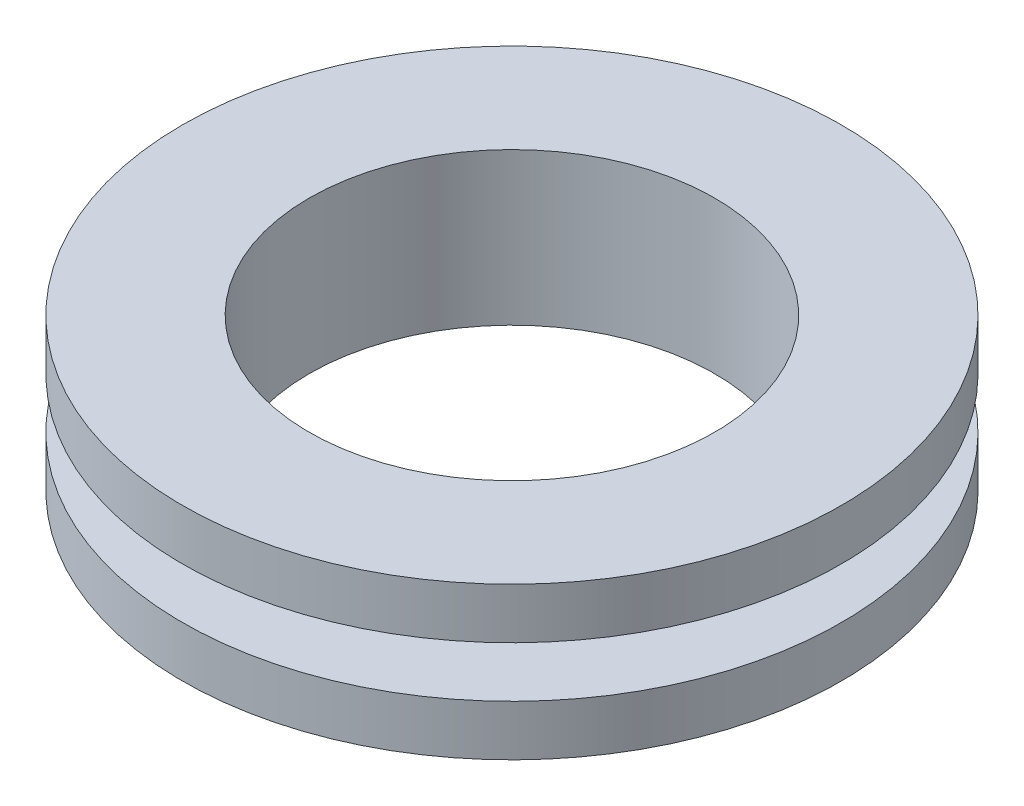
ISO-10303-21;
HEADER;
FILE_DESCRIPTION(('STEP AP214'),'2;1');
FILE_NAME('part.step','',(''),(''),'','','');
FILE_SCHEMA(('AUTOMOTIVE_DESIGN { 1 0 10303 214 1 1 1 1 }'));
ENDSEC;
DATA;
#1=APPLICATION_CONTEXT('core data for automotive mechanical design processes');
#2=APPLICATION_PROTOCOL_DEFINITION('international standard','automotive_design',2000,#1);
#3=PRODUCT_CONTEXT('',#1,'mechanical');
#4=PRODUCT('Part','Part','',(#3));
#5=PRODUCT_RELATED_PRODUCT_CATEGORY('part','',(#4));
#6=PRODUCT_DEFINITION_FORMATION('','',#4);
#7=PRODUCT_DEFINITION_CONTEXT('part definition',#1,'design');
#8=PRODUCT_DEFINITION('design','',#6,#7);
#9=PRODUCT_DEFINITION_SHAPE('','',#8);
#10=(LENGTH_UNIT() NAMED_UNIT(*) SI_UNIT(.MILLI.,.METRE.));
#11=(NAMED_UNIT(*) PLANE_ANGLE_UNIT() SI_UNIT($,.RADIAN.));
#12=(NAMED_UNIT(*) SI_UNIT($,.STERADIAN.) SOLID_ANGLE_UNIT());
#13=UNCERTAINTY_MEASURE_WITH_UNIT(LENGTH_MEASURE(1.E-05),#10,'distance_accuracy_value','');
#14=(GEOMETRIC_REPRESENTATION_CONTEXT(3) GLOBAL_UNCERTAINTY_ASSIGNED_CONTEXT((#13)) GLOBAL_UNIT_ASSIGNED_CONTEXT((#10,
#11,#12)) REPRESENTATION_CONTEXT('',''));
#15=CARTESIAN_POINT('',(0.,0.,0.));
#16=DIRECTION('',(0.,0.,1.));
#17=DIRECTION('',(1.,0.,0.));
#18=AXIS2_PLACEMENT_3D('',#15,#16,#17);
#19=CARTESIAN_POINT('',(5.,0.5,0.));
#20=DIRECTION('',(0.,1.,0.));
#21=DIRECTION('',(-1.,0.,0.));
#22=AXIS2_PLACEMENT_3D('',#19,#20,#21);
#23=PLANE('',#22);
#24=CARTESIAN_POINT('',(0.,0.499999999999999,0.));
#25=DIRECTION('',(0.,1.,0.));
#26=DIRECTION('',(-1.,0.,0.));
#27=AXIS2_PLACEMENT_3D('',#24,#25,#26);
#28=CIRCLE('',#27,6.5);
#29=CARTESIAN_POINT('',(-6.5,0.499999999999998,0.));
#30=VERTEX_POINT('',#29);
#31=EDGE_CURVE('E10',#30,#30,#28,.T.);
#32=ORIENTED_EDGE('',*,*,#31,.F.);
#33=EDGE_LOOP('',(#32));
#34=FACE_BOUND('',#33,.T.);
#35=CARTESIAN_POINT('',(0.,0.5,0.));
#36=DIRECTION('',(0.,1.,0.));
#37=DIRECTION('',(-1.,0.,0.));
#38=AXIS2_PLACEMENT_3D('',#35,#36,#37);
#39=CIRCLE('',#38,5.);
#40=CARTESIAN_POINT('',(-5.,0.499999999999999,0.));
#41=VERTEX_POINT('',#40);
#42=EDGE_CURVE('E78',#41,#41,#39,.T.);
#43=ORIENTED_EDGE('',*,*,#42,.T.);
#44=EDGE_LOOP('',(#43));
#45=FACE_BOUND('',#44,.T.);
#46=ADVANCED_FACE('F43',(#34,#45),#23,.F.);
#47=CARTESIAN_POINT('',(0.,3.8001500254323,0.));
#48=DIRECTION('',(0.,1.,0.));
#49=DIRECTION('',(-1.,0.,0.));
#50=AXIS2_PLACEMENT_3D('',#47,#48,#49);
#51=CYLINDRICAL_SURFACE('',#50,6.5);
#52=CARTESIAN_POINT('',(0.,1.5,0.));
#53=DIRECTION('',(0.,1.,0.));
#54=DIRECTION('',(-1.,0.,0.));
#55=AXIS2_PLACEMENT_3D('',#52,#53,#54);
#56=CIRCLE('',#55,6.5);
#57=CARTESIAN_POINT('',(-6.5,1.5,0.));
#58=VERTEX_POINT('',#57);
#59=EDGE_CURVE('E50',#58,#58,#56,.T.);
#60=ORIENTED_EDGE('',*,*,#59,.F.);
#61=EDGE_LOOP('',(#60));
#62=FACE_BOUND('',#61,.T.);
#63=ORIENTED_EDGE('',*,*,#31,.T.);
#64=EDGE_LOOP('',(#63));
#65=FACE_BOUND('',#64,.T.);
#66=ADVANCED_FACE('F116',(#62,#65),#51,.T.);
#67=CARTESIAN_POINT('',(6.5,1.5,0.));
#68=DIRECTION('',(0.,-1.,0.));
#69=DIRECTION('',(1.,0.,0.));
#70=AXIS2_PLACEMENT_3D('',#67,#68,#69);
#71=PLANE('',#70);
#72=CARTESIAN_POINT('',(0.,1.5,0.));
#73=DIRECTION('',(0.,1.,0.));
#74=DIRECTION('',(-1.,0.,0.));
#75=AXIS2_PLACEMENT_3D('',#72,#73,#74);
#76=CIRCLE('',#75,4.);
#77=CARTESIAN_POINT('',(-4.,1.5,0.));
#78=VERTEX_POINT('',#77);
#79=EDGE_CURVE('E55',#78,#78,#76,.T.);
#80=ORIENTED_EDGE('',*,*,#79,.F.);
#81=EDGE_LOOP('',(#80));
#82=FACE_BOUND('',#81,.T.);
#83=ORIENTED_EDGE('',*,*,#59,.T.);
#84=EDGE_LOOP('',(#83));
#85=FACE_BOUND('',#84,.T.);
#86=ADVANCED_FACE('F111',(#82,#85),#71,.F.);
#87=CARTESIAN_POINT('',(0.,3.8001500254323,0.));
#88=DIRECTION('',(0.,1.,0.));
#89=DIRECTION('',(-1.,0.,0.));
#90=AXIS2_PLACEMENT_3D('',#87,#88,#89);
#91=CYLINDRICAL_SURFACE('',#90,4.);
#92=CARTESIAN_POINT('',(0.,-1.5,0.));
#93=DIRECTION('',(0.,1.,0.));
#94=DIRECTION('',(-1.,0.,0.));
#95=AXIS2_PLACEMENT_3D('',#92,#93,#94);
#96=CIRCLE('',#95,4.);
#97=CARTESIAN_POINT('',(-4.,-1.5,0.));
#98=VERTEX_POINT('',#97);
#99=EDGE_CURVE('E60',#98,#98,#96,.T.);
#100=ORIENTED_EDGE('',*,*,#99,.F.);
#101=EDGE_LOOP('',(#100));
#102=FACE_BOUND('',#101,.T.);
#103=ORIENTED_EDGE('',*,*,#79,.T.);
#104=EDGE_LOOP('',(#103));
#105=FACE_BOUND('',#104,.T.);
#106=ADVANCED_FACE('F105',(#102,#105),#91,.F.);
#107=CARTESIAN_POINT('',(4.,-1.5,0.));
#108=DIRECTION('',(0.,1.,0.));
#109=DIRECTION('',(-1.,0.,0.));
#110=AXIS2_PLACEMENT_3D('',#107,#108,#109);
#111=PLANE('',#110);
#112=CARTESIAN_POINT('',(0.,-1.5,0.));
#113=DIRECTION('',(0.,1.,0.));
#114=DIRECTION('',(-1.,0.,0.));
#115=AXIS2_PLACEMENT_3D('',#112,#113,#114);
#116=CIRCLE('',#115,6.5);
#117=CARTESIAN_POINT('',(-6.5,-1.5,0.));
#118=VERTEX_POINT('',#117);
#119=EDGE_CURVE('E66',#118,#118,#116,.T.);
#120=ORIENTED_EDGE('',*,*,#119,.F.);
#121=EDGE_LOOP('',(#120));
#122=FACE_BOUND('',#121,.T.);
#123=ORIENTED_EDGE('',*,*,#99,.T.);
#124=EDGE_LOOP('',(#123));
#125=FACE_BOUND('',#124,.T.);
#126=ADVANCED_FACE('F99',(#122,#125),#111,.F.);
#127=CARTESIAN_POINT('',(0.,3.8001500254323,0.));
#128=DIRECTION('',(0.,1.,0.));
#129=DIRECTION('',(-1.,0.,0.));
#130=AXIS2_PLACEMENT_3D('',#127,#128,#129);
#131=CYLINDRICAL_SURFACE('',#130,6.5);
#132=CARTESIAN_POINT('',(0.,-0.500000000000001,0.));
#133=DIRECTION('',(0.,1.,0.));
#134=DIRECTION('',(-1.,0.,0.));
#135=AXIS2_PLACEMENT_3D('',#132,#133,#134);
#136=CIRCLE('',#135,6.5);
#137=CARTESIAN_POINT('',(-6.5,-0.500000000000002,0.));
#138=VERTEX_POINT('',#137);
#139=EDGE_CURVE('E70',#138,#138,#136,.T.);
#140=ORIENTED_EDGE('',*,*,#139,.F.);
#141=EDGE_LOOP('',(#140));
#142=FACE_BOUND('',#141,.T.);
#143=ORIENTED_EDGE('',*,*,#119,.T.);
#144=EDGE_LOOP('',(#143));
#145=FACE_BOUND('',#144,.T.);
#146=ADVANCED_FACE('F93',(#142,#145),#131,.T.);
#147=CARTESIAN_POINT('',(5.,-0.5,0.));
#148=DIRECTION('',(0.,-1.,0.));
#149=DIRECTION('',(1.,0.,0.));
#150=AXIS2_PLACEMENT_3D('',#147,#148,#149);
#151=PLANE('',#150);
#152=CARTESIAN_POINT('',(0.,-0.500000000000001,0.));
#153=DIRECTION('',(0.,1.,0.));
#154=DIRECTION('',(-1.,0.,0.));
#155=AXIS2_PLACEMENT_3D('',#152,#153,#154);
#156=CIRCLE('',#155,5.);
#157=CARTESIAN_POINT('',(-5.,-0.500000000000002,0.));
#158=VERTEX_POINT('',#157);
#159=EDGE_CURVE('E74',#158,#158,#156,.T.);
#160=ORIENTED_EDGE('',*,*,#159,.F.);
#161=EDGE_LOOP('',(#160));
#162=FACE_BOUND('',#161,.T.);
#163=ORIENTED_EDGE('',*,*,#139,.T.);
#164=EDGE_LOOP('',(#163));
#165=FACE_BOUND('',#164,.T.);
#166=ADVANCED_FACE('F87',(#162,#165),#151,.F.);
#167=CARTESIAN_POINT('',(0.,3.8001500254323,0.));
#168=DIRECTION('',(0.,1.,0.));
#169=DIRECTION('',(-1.,0.,0.));
#170=AXIS2_PLACEMENT_3D('',#167,#168,#169);
#171=CYLINDRICAL_SURFACE('',#170,5.);
#172=ORIENTED_EDGE('',*,*,#42,.F.);
#173=EDGE_LOOP('',(#172));
#174=FACE_BOUND('',#173,.T.);
#175=ORIENTED_EDGE('',*,*,#159,.T.);
#176=EDGE_LOOP('',(#175));
#177=FACE_BOUND('',#176,.T.);
#178=ADVANCED_FACE('F84',(#174,#177),#171,.T.);
#179=CLOSED_SHELL('',(#46,#66,#86,#106,#126,#146,#166,#178));
#180=MANIFOLD_SOLID_BREP('B2',#179);
#181=ADVANCED_BREP_SHAPE_REPRESENTATION('',(#18,#180),#14);
#182=SHAPE_DEFINITION_REPRESENTATION(#9,#181);
ENDSEC;
END-ISO-10303-21;
